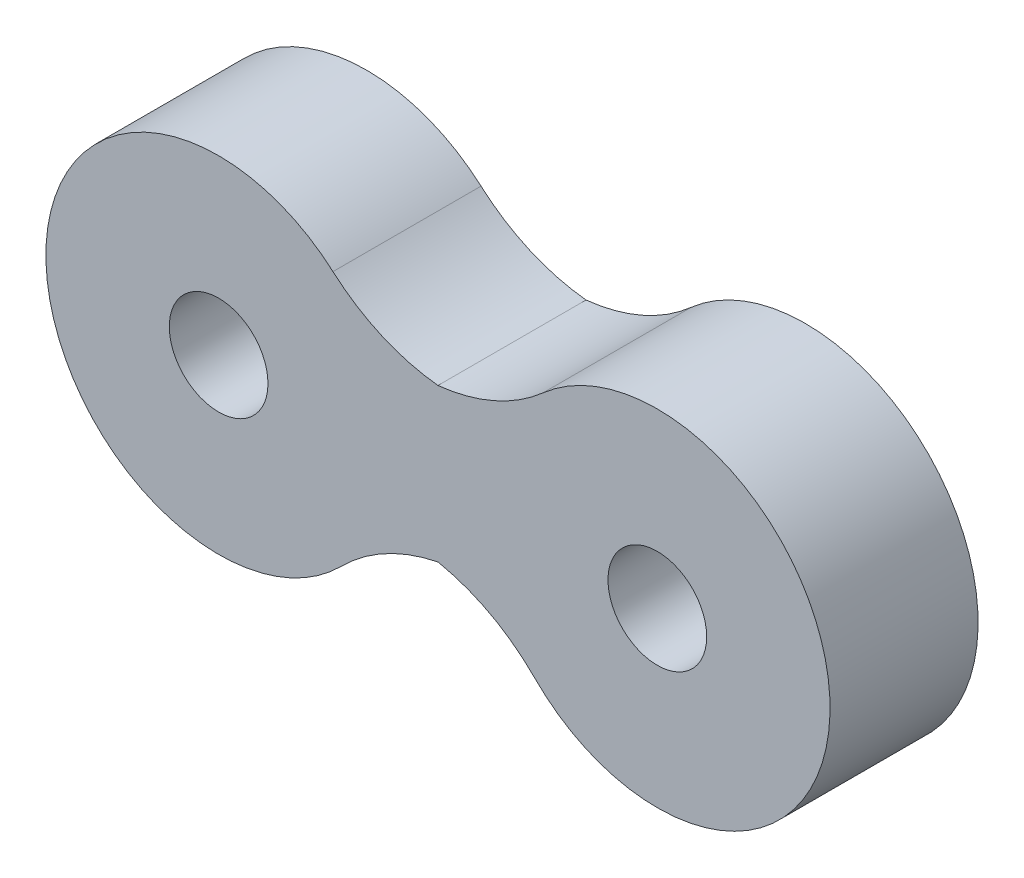
ISO-10303-21;
HEADER;
FILE_DESCRIPTION(('STEP AP214'),'2;1');
FILE_NAME('part.step','',(''),(''),'','','');
FILE_SCHEMA(('AUTOMOTIVE_DESIGN { 1 0 10303 214 1 1 1 1 }'));
ENDSEC;
DATA;
#1=APPLICATION_CONTEXT('core data for automotive mechanical design processes');
#2=APPLICATION_PROTOCOL_DEFINITION('international standard','automotive_design',2000,#1);
#3=PRODUCT_CONTEXT('',#1,'mechanical');
#4=PRODUCT('Part','Part','',(#3));
#5=PRODUCT_RELATED_PRODUCT_CATEGORY('part','',(#4));
#6=PRODUCT_DEFINITION_FORMATION('','',#4);
#7=PRODUCT_DEFINITION_CONTEXT('part definition',#1,'design');
#8=PRODUCT_DEFINITION('design','',#6,#7);
#9=PRODUCT_DEFINITION_SHAPE('','',#8);
#10=(LENGTH_UNIT() NAMED_UNIT(*) SI_UNIT(.MILLI.,.METRE.));
#11=(NAMED_UNIT(*) PLANE_ANGLE_UNIT() SI_UNIT($,.RADIAN.));
#12=(NAMED_UNIT(*) SI_UNIT($,.STERADIAN.) SOLID_ANGLE_UNIT());
#13=UNCERTAINTY_MEASURE_WITH_UNIT(LENGTH_MEASURE(1.E-05),#10,'distance_accuracy_value','');
#14=(GEOMETRIC_REPRESENTATION_CONTEXT(3) GLOBAL_UNCERTAINTY_ASSIGNED_CONTEXT((#13)) GLOBAL_UNIT_ASSIGNED_CONTEXT((#10,
#11,#12)) REPRESENTATION_CONTEXT('',''));
#15=CARTESIAN_POINT('',(0.,0.,0.));
#16=DIRECTION('',(0.,0.,1.));
#17=DIRECTION('',(1.,0.,0.));
#18=AXIS2_PLACEMENT_3D('',#15,#16,#17);
#19=CARTESIAN_POINT('',(-4.445,-1.66975840571727,3.));
#20=DIRECTION('',(0.,0.,-1.));
#21=DIRECTION('',(-1.,0.,0.));
#22=AXIS2_PLACEMENT_3D('',#19,#20,#21);
#23=CYLINDRICAL_SURFACE('',#22,3.5);
#24=CARTESIAN_POINT('',(-4.445,-1.66975840571727,0.));
#25=DIRECTION('',(0.,0.,1.));
#26=DIRECTION('',(1.,0.,0.));
#27=AXIS2_PLACEMENT_3D('',#24,#25,#26);
#28=CIRCLE('',#27,3.5);
#29=CARTESIAN_POINT('',(-1.95865581610337,-4.13310827920326,0.));
#30=VERTEX_POINT('',#29);
#31=CARTESIAN_POINT('',(-2.12777963139497,0.953310362600091,0.));
#32=VERTEX_POINT('',#31);
#33=EDGE_CURVE('E113',#30,#32,#28,.F.);
#34=ORIENTED_EDGE('',*,*,#33,.F.);
#35=DIRECTION('',(0.,0.,-1.));
#36=VECTOR('',#35,1.);
#37=CARTESIAN_POINT('',(-1.95865581610337,-4.13310827920326,3.));
#38=LINE('',#37,#36);
#39=CARTESIAN_POINT('',(-1.95865581610337,-4.13310827920326,3.));
#40=VERTEX_POINT('',#39);
#41=EDGE_CURVE('E130',#30,#40,#38,.F.);
#42=ORIENTED_EDGE('',*,*,#41,.T.);
#43=CARTESIAN_POINT('',(-4.445,-1.66975840571727,3.));
#44=DIRECTION('',(0.,0.,1.));
#45=DIRECTION('',(1.,0.,0.));
#46=AXIS2_PLACEMENT_3D('',#43,#44,#45);
#47=CIRCLE('',#46,3.5);
#48=CARTESIAN_POINT('',(-2.12777963139497,0.953310362600091,3.));
#49=VERTEX_POINT('',#48);
#50=EDGE_CURVE('E125',#40,#49,#47,.F.);
#51=ORIENTED_EDGE('',*,*,#50,.T.);
#52=DIRECTION('',(0.,0.,-1.));
#53=VECTOR('',#52,1.);
#54=CARTESIAN_POINT('',(-2.12777963139497,0.953310362600091,3.));
#55=LINE('',#54,#53);
#56=EDGE_CURVE('E116',#49,#32,#55,.T.);
#57=ORIENTED_EDGE('',*,*,#56,.T.);
#58=EDGE_LOOP('',(#34,#42,#51,#57));
#59=FACE_BOUND('',#58,.T.);
#60=ADVANCED_FACE('F42',(#59),#23,.T.);
#61=CARTESIAN_POINT('',(4.445,-1.66975840571727,3.));
#62=DIRECTION('',(0.,0.,-1.));
#63=DIRECTION('',(-1.,0.,0.));
#64=AXIS2_PLACEMENT_3D('',#61,#62,#63);
#65=CYLINDRICAL_SURFACE('',#64,3.5);
#66=CARTESIAN_POINT('',(4.445,-1.66975840571727,3.));
#67=DIRECTION('',(0.,0.,1.));
#68=DIRECTION('',(1.,0.,0.));
#69=AXIS2_PLACEMENT_3D('',#66,#67,#68);
#70=CIRCLE('',#69,3.5);
#71=CARTESIAN_POINT('',(2.12777963139497,0.953310362600095,3.));
#72=VERTEX_POINT('',#71);
#73=CARTESIAN_POINT('',(1.95865581610339,-4.13310827920327,3.));
#74=VERTEX_POINT('',#73);
#75=EDGE_CURVE('E118',#72,#74,#70,.F.);
#76=ORIENTED_EDGE('',*,*,#75,.T.);
#77=DIRECTION('',(0.,0.,-1.));
#78=VECTOR('',#77,1.);
#79=CARTESIAN_POINT('',(1.95865581610339,-4.13310827920327,3.));
#80=LINE('',#79,#78);
#81=CARTESIAN_POINT('',(1.95865581610339,-4.13310827920327,0.));
#82=VERTEX_POINT('',#81);
#83=EDGE_CURVE('E114',#74,#82,#80,.T.);
#84=ORIENTED_EDGE('',*,*,#83,.T.);
#85=CARTESIAN_POINT('',(4.445,-1.66975840571727,0.));
#86=DIRECTION('',(0.,0.,1.));
#87=DIRECTION('',(1.,0.,0.));
#88=AXIS2_PLACEMENT_3D('',#85,#86,#87);
#89=CIRCLE('',#88,3.5);
#90=CARTESIAN_POINT('',(2.12777963139497,0.953310362600095,0.));
#91=VERTEX_POINT('',#90);
#92=EDGE_CURVE('E99',#91,#82,#89,.F.);
#93=ORIENTED_EDGE('',*,*,#92,.F.);
#94=DIRECTION('',(0.,0.,-1.));
#95=VECTOR('',#94,1.);
#96=CARTESIAN_POINT('',(2.12777963139497,0.953310362600095,3.));
#97=LINE('',#96,#95);
#98=EDGE_CURVE('E112',#91,#72,#97,.F.);
#99=ORIENTED_EDGE('',*,*,#98,.T.);
#100=EDGE_LOOP('',(#76,#84,#93,#99));
#101=FACE_BOUND('',#100,.T.);
#102=ADVANCED_FACE('F109',(#101),#65,.T.);
#103=CARTESIAN_POINT('',(4.445,-1.66975840571727,3.));
#104=DIRECTION('',(0.,0.,-1.));
#105=DIRECTION('',(-1.,0.,0.));
#106=AXIS2_PLACEMENT_3D('',#103,#104,#105);
#107=CYLINDRICAL_SURFACE('',#106,1.);
#108=CARTESIAN_POINT('',(4.445,-1.66975840571727,3.));
#109=DIRECTION('',(0.,0.,1.));
#110=DIRECTION('',(1.,0.,0.));
#111=AXIS2_PLACEMENT_3D('',#108,#109,#110);
#112=CIRCLE('',#111,1.);
#113=CARTESIAN_POINT('',(5.445,-1.66975840571727,3.));
#114=VERTEX_POINT('',#113);
#115=EDGE_CURVE('E154',#114,#114,#112,.T.);
#116=ORIENTED_EDGE('',*,*,#115,.T.);
#117=EDGE_LOOP('',(#116));
#118=FACE_BOUND('',#117,.T.);
#119=CARTESIAN_POINT('',(4.445,-1.66975840571727,0.));
#120=DIRECTION('',(0.,0.,1.));
#121=DIRECTION('',(1.,0.,0.));
#122=AXIS2_PLACEMENT_3D('',#119,#120,#121);
#123=CIRCLE('',#122,1.);
#124=CARTESIAN_POINT('',(5.445,-1.66975840571727,0.));
#125=VERTEX_POINT('',#124);
#126=EDGE_CURVE('E145',#125,#125,#123,.T.);
#127=ORIENTED_EDGE('',*,*,#126,.F.);
#128=EDGE_LOOP('',(#127));
#129=FACE_BOUND('',#128,.T.);
#130=ADVANCED_FACE('F179',(#118,#129),#107,.F.);
#131=CARTESIAN_POINT('',(-4.445,-1.66975840571727,3.));
#132=DIRECTION('',(0.,0.,-1.));
#133=DIRECTION('',(-1.,0.,0.));
#134=AXIS2_PLACEMENT_3D('',#131,#132,#133);
#135=CYLINDRICAL_SURFACE('',#134,1.);
#136=CARTESIAN_POINT('',(-4.445,-1.66975840571727,3.));
#137=DIRECTION('',(0.,0.,1.));
#138=DIRECTION('',(1.,0.,0.));
#139=AXIS2_PLACEMENT_3D('',#136,#137,#138);
#140=CIRCLE('',#139,1.);
#141=CARTESIAN_POINT('',(-3.445,-1.66975840571727,3.));
#142=VERTEX_POINT('',#141);
#143=EDGE_CURVE('E111',#142,#142,#140,.T.);
#144=ORIENTED_EDGE('',*,*,#143,.T.);
#145=EDGE_LOOP('',(#144));
#146=FACE_BOUND('',#145,.T.);
#147=CARTESIAN_POINT('',(-4.445,-1.66975840571727,0.));
#148=DIRECTION('',(0.,0.,1.));
#149=DIRECTION('',(1.,0.,0.));
#150=AXIS2_PLACEMENT_3D('',#147,#148,#149);
#151=CIRCLE('',#150,1.);
#152=CARTESIAN_POINT('',(-3.445,-1.66975840571727,0.));
#153=VERTEX_POINT('',#152);
#154=EDGE_CURVE('E138',#153,#153,#151,.T.);
#155=ORIENTED_EDGE('',*,*,#154,.F.);
#156=EDGE_LOOP('',(#155));
#157=FACE_BOUND('',#156,.T.);
#158=ADVANCED_FACE('F183',(#146,#157),#135,.F.);
#159=CARTESIAN_POINT('',(0.,0.,3.));
#160=DIRECTION('',(0.,0.,1.));
#161=DIRECTION('',(1.,0.,0.));
#162=AXIS2_PLACEMENT_3D('',#159,#160,#161);
#163=PLANE('',#162);
#164=ORIENTED_EDGE('',*,*,#143,.F.);
#165=EDGE_LOOP('',(#164));
#166=FACE_BOUND('',#165,.T.);
#167=ORIENTED_EDGE('',*,*,#115,.F.);
#168=EDGE_LOOP('',(#167));
#169=FACE_BOUND('',#168,.T.);
#170=ORIENTED_EDGE('',*,*,#50,.F.);
#171=CARTESIAN_POINT('',(0.74790742408128,-6.81464057005517,3.));
#172=DIRECTION('',(0.,0.,1.));
#173=DIRECTION('',(1.,0.,0.));
#174=AXIS2_PLACEMENT_3D('',#171,#172,#173);
#175=CIRCLE('',#174,3.81);
#176=CARTESIAN_POINT('',(0.,-3.0787692546852,3.));
#177=VERTEX_POINT('',#176);
#178=EDGE_CURVE('E102',#40,#177,#175,.F.);
#179=ORIENTED_EDGE('',*,*,#178,.T.);
#180=CARTESIAN_POINT('',(-0.747907424081213,-6.81464057005517,3.));
#181=DIRECTION('',(0.,0.,1.));
#182=DIRECTION('',(1.,0.,0.));
#183=AXIS2_PLACEMENT_3D('',#180,#181,#182);
#184=CIRCLE('',#183,3.81);
#185=EDGE_CURVE('E132',#177,#74,#184,.F.);
#186=ORIENTED_EDGE('',*,*,#185,.T.);
#187=ORIENTED_EDGE('',*,*,#75,.F.);
#188=CARTESIAN_POINT('',(-0.394680255572216,3.80870807896843,3.));
#189=DIRECTION('',(0.,0.,1.));
#190=DIRECTION('',(1.,0.,0.));
#191=AXIS2_PLACEMENT_3D('',#188,#189,#190);
#192=CIRCLE('',#191,3.81);
#193=CARTESIAN_POINT('',(0.,0.019205803489302,3.));
#194=VERTEX_POINT('',#193);
#195=EDGE_CURVE('E58',#72,#194,#192,.F.);
#196=ORIENTED_EDGE('',*,*,#195,.T.);
#197=CARTESIAN_POINT('',(0.39468025557222,3.80870807896842,3.));
#198=DIRECTION('',(0.,0.,1.));
#199=DIRECTION('',(1.,0.,0.));
#200=AXIS2_PLACEMENT_3D('',#197,#198,#199);
#201=CIRCLE('',#200,3.81);
#202=EDGE_CURVE('E12',#194,#49,#201,.F.);
#203=ORIENTED_EDGE('',*,*,#202,.T.);
#204=EDGE_LOOP('',(#170,#179,#186,#187,#196,#203));
#205=FACE_BOUND('',#204,.T.);
#206=ADVANCED_FACE('F147',(#166,#169,#205),#163,.T.);
#207=CARTESIAN_POINT('',(0.,0.,0.));
#208=DIRECTION('',(0.,0.,1.));
#209=DIRECTION('',(1.,0.,0.));
#210=AXIS2_PLACEMENT_3D('',#207,#208,#209);
#211=PLANE('',#210);
#212=ORIENTED_EDGE('',*,*,#154,.T.);
#213=EDGE_LOOP('',(#212));
#214=FACE_BOUND('',#213,.T.);
#215=ORIENTED_EDGE('',*,*,#126,.T.);
#216=EDGE_LOOP('',(#215));
#217=FACE_BOUND('',#216,.T.);
#218=CARTESIAN_POINT('',(-0.747907424081213,-6.81464057005517,0.));
#219=DIRECTION('',(0.,0.,1.));
#220=DIRECTION('',(1.,0.,0.));
#221=AXIS2_PLACEMENT_3D('',#218,#219,#220);
#222=CIRCLE('',#221,3.81);
#223=CARTESIAN_POINT('',(0.,-3.0787692546852,0.));
#224=VERTEX_POINT('',#223);
#225=EDGE_CURVE('E129',#82,#224,#222,.T.);
#226=ORIENTED_EDGE('',*,*,#225,.T.);
#227=CARTESIAN_POINT('',(0.74790742408128,-6.81464057005517,0.));
#228=DIRECTION('',(0.,0.,1.));
#229=DIRECTION('',(1.,0.,0.));
#230=AXIS2_PLACEMENT_3D('',#227,#228,#229);
#231=CIRCLE('',#230,3.81);
#232=EDGE_CURVE('E133',#224,#30,#231,.T.);
#233=ORIENTED_EDGE('',*,*,#232,.T.);
#234=ORIENTED_EDGE('',*,*,#33,.T.);
#235=CARTESIAN_POINT('',(0.39468025557222,3.80870807896842,0.));
#236=DIRECTION('',(0.,0.,1.));
#237=DIRECTION('',(1.,0.,0.));
#238=AXIS2_PLACEMENT_3D('',#235,#236,#237);
#239=CIRCLE('',#238,3.81);
#240=CARTESIAN_POINT('',(0.,0.019205803489302,0.));
#241=VERTEX_POINT('',#240);
#242=EDGE_CURVE('E52',#32,#241,#239,.T.);
#243=ORIENTED_EDGE('',*,*,#242,.T.);
#244=CARTESIAN_POINT('',(-0.394680255572216,3.80870807896843,0.));
#245=DIRECTION('',(0.,0.,1.));
#246=DIRECTION('',(1.,0.,0.));
#247=AXIS2_PLACEMENT_3D('',#244,#245,#246);
#248=CIRCLE('',#247,3.81);
#249=EDGE_CURVE('E100',#241,#91,#248,.T.);
#250=ORIENTED_EDGE('',*,*,#249,.T.);
#251=ORIENTED_EDGE('',*,*,#92,.T.);
#252=EDGE_LOOP('',(#226,#233,#234,#243,#250,#251));
#253=FACE_BOUND('',#252,.T.);
#254=ADVANCED_FACE('F97',(#214,#217,#253),#211,.F.);
#255=CARTESIAN_POINT('',(0.74790742408128,-6.81464057005517,3.));
#256=DIRECTION('',(0.,0.,-1.));
#257=DIRECTION('',(-1.,0.,0.));
#258=AXIS2_PLACEMENT_3D('',#255,#256,#257);
#259=CYLINDRICAL_SURFACE('',#258,3.81);
#260=DIRECTION('',(0.,0.,-1.));
#261=VECTOR('',#260,1.);
#262=CARTESIAN_POINT('',(0.,-3.0787692546852,1.5));
#263=LINE('',#262,#261);
#264=EDGE_CURVE('E140',#177,#224,#263,.T.);
#265=ORIENTED_EDGE('',*,*,#264,.F.);
#266=ORIENTED_EDGE('',*,*,#178,.F.);
#267=ORIENTED_EDGE('',*,*,#41,.F.);
#268=ORIENTED_EDGE('',*,*,#232,.F.);
#269=EDGE_LOOP('',(#265,#266,#267,#268));
#270=FACE_BOUND('',#269,.T.);
#271=ADVANCED_FACE('F163',(#270),#259,.F.);
#272=CARTESIAN_POINT('',(-0.747907424081213,-6.81464057005517,3.));
#273=DIRECTION('',(0.,0.,-1.));
#274=DIRECTION('',(-1.,0.,0.));
#275=AXIS2_PLACEMENT_3D('',#272,#273,#274);
#276=CYLINDRICAL_SURFACE('',#275,3.81);
#277=ORIENTED_EDGE('',*,*,#185,.F.);
#278=ORIENTED_EDGE('',*,*,#264,.T.);
#279=ORIENTED_EDGE('',*,*,#225,.F.);
#280=ORIENTED_EDGE('',*,*,#83,.F.);
#281=EDGE_LOOP('',(#277,#278,#279,#280));
#282=FACE_BOUND('',#281,.T.);
#283=ADVANCED_FACE('F164',(#282),#276,.F.);
#284=CARTESIAN_POINT('',(0.39468025557222,3.80870807896842,3.));
#285=DIRECTION('',(0.,0.,1.));
#286=DIRECTION('',(1.,0.,0.));
#287=AXIS2_PLACEMENT_3D('',#284,#285,#286);
#288=CYLINDRICAL_SURFACE('',#287,3.81);
#289=ORIENTED_EDGE('',*,*,#56,.F.);
#290=ORIENTED_EDGE('',*,*,#202,.F.);
#291=DIRECTION('',(0.,0.,1.));
#292=VECTOR('',#291,1.);
#293=CARTESIAN_POINT('',(0.,0.019205803489302,1.5));
#294=LINE('',#293,#292);
#295=EDGE_CURVE('E48',#241,#194,#294,.T.);
#296=ORIENTED_EDGE('',*,*,#295,.F.);
#297=ORIENTED_EDGE('',*,*,#242,.F.);
#298=EDGE_LOOP('',(#289,#290,#296,#297));
#299=FACE_BOUND('',#298,.T.);
#300=ADVANCED_FACE('F46',(#299),#288,.F.);
#301=CARTESIAN_POINT('',(-0.394680255572216,3.80870807896843,3.));
#302=DIRECTION('',(0.,0.,1.));
#303=DIRECTION('',(1.,0.,0.));
#304=AXIS2_PLACEMENT_3D('',#301,#302,#303);
#305=CYLINDRICAL_SURFACE('',#304,3.81);
#306=ORIENTED_EDGE('',*,*,#195,.F.);
#307=ORIENTED_EDGE('',*,*,#98,.F.);
#308=ORIENTED_EDGE('',*,*,#249,.F.);
#309=ORIENTED_EDGE('',*,*,#295,.T.);
#310=EDGE_LOOP('',(#306,#307,#308,#309));
#311=FACE_BOUND('',#310,.T.);
#312=ADVANCED_FACE('F120',(#311),#305,.F.);
#313=CLOSED_SHELL('',(#60,#102,#130,#158,#206,#254,#271,#283,#300,#312));
#314=MANIFOLD_SOLID_BREP('B2',#313);
#315=ADVANCED_BREP_SHAPE_REPRESENTATION('',(#18,#314),#14);
#316=SHAPE_DEFINITION_REPRESENTATION(#9,#315);
ENDSEC;
END-ISO-10303-21;
